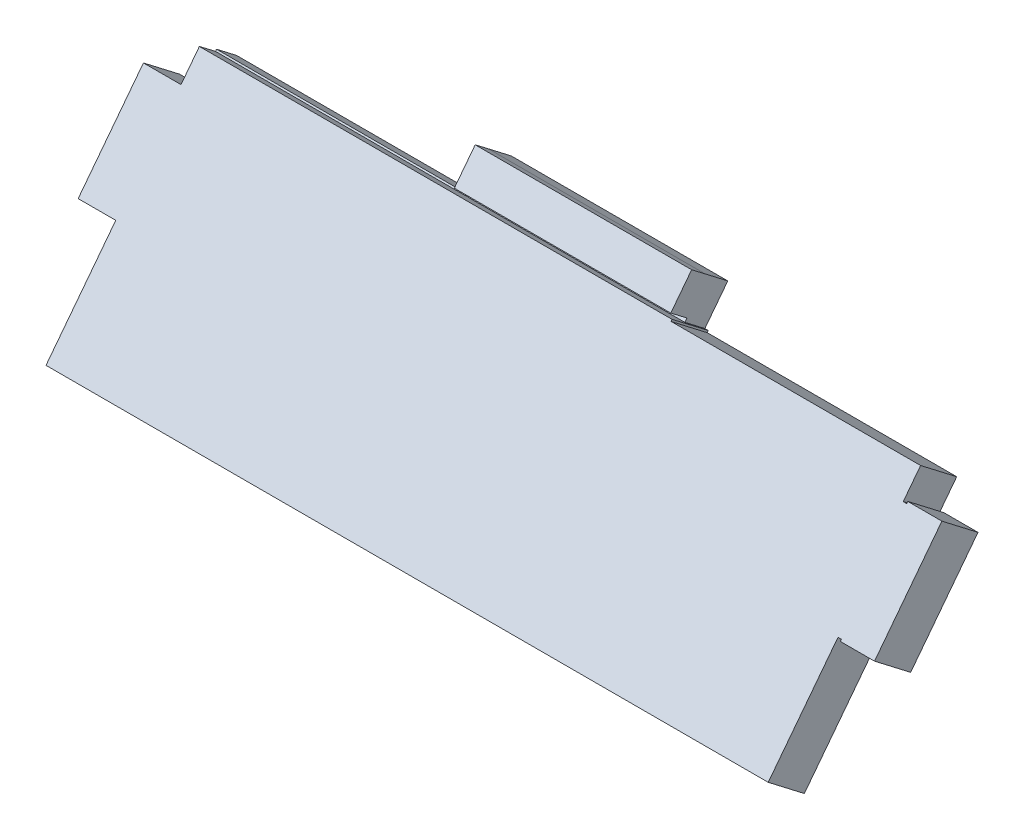
ISO-10303-21;
HEADER;
FILE_DESCRIPTION(('STEP AP214'),'2;1');
FILE_NAME('part.step','',(''),(''),'','','');
FILE_SCHEMA(('AUTOMOTIVE_DESIGN { 1 0 10303 214 1 1 1 1 }'));
ENDSEC;
DATA;
#1=APPLICATION_CONTEXT('core data for automotive mechanical design processes');
#2=APPLICATION_PROTOCOL_DEFINITION('international standard','automotive_design',2000,#1);
#3=PRODUCT_CONTEXT('',#1,'mechanical');
#4=PRODUCT('Part','Part','',(#3));
#5=PRODUCT_RELATED_PRODUCT_CATEGORY('part','',(#4));
#6=PRODUCT_DEFINITION_FORMATION('','',#4);
#7=PRODUCT_DEFINITION_CONTEXT('part definition',#1,'design');
#8=PRODUCT_DEFINITION('design','',#6,#7);
#9=PRODUCT_DEFINITION_SHAPE('','',#8);
#10=(LENGTH_UNIT() NAMED_UNIT(*) SI_UNIT(.MILLI.,.METRE.));
#11=(NAMED_UNIT(*) PLANE_ANGLE_UNIT() SI_UNIT($,.RADIAN.));
#12=(NAMED_UNIT(*) SI_UNIT($,.STERADIAN.) SOLID_ANGLE_UNIT());
#13=UNCERTAINTY_MEASURE_WITH_UNIT(LENGTH_MEASURE(1.E-05),#10,'distance_accuracy_value','');
#14=(GEOMETRIC_REPRESENTATION_CONTEXT(3) GLOBAL_UNCERTAINTY_ASSIGNED_CONTEXT((#13)) GLOBAL_UNIT_ASSIGNED_CONTEXT((#10,
#11,#12)) REPRESENTATION_CONTEXT('',''));
#15=CARTESIAN_POINT('',(0.,0.,0.));
#16=DIRECTION('',(0.,0.,1.));
#17=DIRECTION('',(1.,0.,0.));
#18=AXIS2_PLACEMENT_3D('',#15,#16,#17);
#19=CARTESIAN_POINT('',(285.200000000001,78.6438868512442,-60.463038799988));
#20=DIRECTION('',(-1.,0.,0.));
#21=DIRECTION('',(0.,0.,-1.));
#22=AXIS2_PLACEMENT_3D('',#19,#20,#21);
#23=PLANE('',#22);
#24=DIRECTION('',(0.,-0.609506439516001,-0.792781117452055));
#25=VECTOR('',#24,1.);
#26=CARTESIAN_POINT('',(285.200000000001,81.2600645388355,-62.4744100503904));
#27=LINE('',#26,#25);
#28=CARTESIAN_POINT('',(285.200000000001,201.833533007389,94.3547272159438));
#29=VERTEX_POINT('',#28);
#30=CARTESIAN_POINT('',(285.200000000001,200.296538149277,92.3555678598922));
#31=VERTEX_POINT('',#30);
#32=EDGE_CURVE('E235',#29,#31,#27,.T.);
#33=ORIENTED_EDGE('',*,*,#32,.T.);
#34=DIRECTION('',(0.,0.792781117452051,-0.609506439516005));
#35=VECTOR('',#34,1.);
#36=CARTESIAN_POINT('',(285.200000000001,197.680360461686,94.3669391102944));
#37=LINE('',#36,#35);
#38=CARTESIAN_POINT('',(285.200000000001,197.680360461686,94.3669391102944));
#39=VERTEX_POINT('',#38);
#40=EDGE_CURVE('E293',#39,#31,#37,.T.);
#41=ORIENTED_EDGE('',*,*,#40,.F.);
#42=DIRECTION('',(0.,-0.609506439516003,-0.792781117452053));
#43=VECTOR('',#42,1.);
#44=CARTESIAN_POINT('',(285.200000000001,78.6438868512442,-60.463038799988));
#45=LINE('',#44,#43);
#46=CARTESIAN_POINT('',(285.200000000001,199.034503387945,96.1282641311136));
#47=VERTEX_POINT('',#46);
#48=EDGE_CURVE('E287',#47,#39,#45,.T.);
#49=ORIENTED_EDGE('',*,*,#48,.F.);
#50=DIRECTION('',(0.,0.792781117452081,-0.609506439515965));
#51=VECTOR('',#50,1.);
#52=CARTESIAN_POINT('',(285.200000000001,199.272337723181,95.9454121992587));
#53=LINE('',#52,#51);
#54=CARTESIAN_POINT('',(285.200000000001,199.272337723181,95.9454121992587));
#55=VERTEX_POINT('',#54);
#56=EDGE_CURVE('E429',#47,#55,#53,.T.);
#57=ORIENTED_EDGE('',*,*,#56,.T.);
#58=CARTESIAN_POINT('',(285.199999999975,4.24818282997647,245.883996320196));
#59=DIRECTION('',(1.,0.,0.));
#60=DIRECTION('',(0.,0.,-1.));
#61=AXIS2_PLACEMENT_3D('',#58,#59,#60);
#62=CIRCLE('',#61,246.);
#63=CARTESIAN_POINT('',(285.200000000001,200.351124877341,97.3591293100959));
#64=VERTEX_POINT('',#63);
#65=EDGE_CURVE('E310',#55,#64,#62,.T.);
#66=ORIENTED_EDGE('',*,*,#65,.T.);
#67=DIRECTION('',(0.,0.792781117452051,-0.609506439516005));
#68=VECTOR('',#67,1.);
#69=CARTESIAN_POINT('',(285.200000000001,200.11838621975,97.5380635801026));
#70=LINE('',#69,#68);
#71=CARTESIAN_POINT('',(285.200000000001,202.731075398266,95.5293743672744));
#72=VERTEX_POINT('',#71);
#73=EDGE_CURVE('E238',#64,#72,#70,.T.);
#74=ORIENTED_EDGE('',*,*,#73,.T.);
#75=CARTESIAN_POINT('',(285.200000000001,4.97086643496067,245.706796954713));
#76=DIRECTION('',(1.,0.,0.));
#77=DIRECTION('',(0.,0.,-1.));
#78=AXIS2_PLACEMENT_3D('',#75,#76,#77);
#79=CIRCLE('',#78,248.319065929736);
#80=EDGE_CURVE('E227',#72,#29,#79,.F.);
#81=ORIENTED_EDGE('',*,*,#80,.T.);
#82=EDGE_LOOP('',(#33,#41,#49,#57,#66,#74,#81));
#83=FACE_BOUND('',#82,.T.);
#84=ADVANCED_FACE('F36',(#83),#23,.T.);
#85=CARTESIAN_POINT('',(304.199999999999,78.6438868512442,-60.463038799988));
#86=DIRECTION('',(1.,0.,0.));
#87=DIRECTION('',(0.,0.,1.));
#88=AXIS2_PLACEMENT_3D('',#85,#86,#87);
#89=PLANE('',#88);
#90=DIRECTION('',(0.,0.609506439516001,0.792781117452055));
#91=VECTOR('',#90,1.);
#92=CARTESIAN_POINT('',(304.199999999999,81.2600645388355,-62.4744100503904));
#93=LINE('',#92,#91);
#94=CARTESIAN_POINT('',(304.199999999999,200.296538149277,92.3555678598922));
#95=VERTEX_POINT('',#94);
#96=CARTESIAN_POINT('',(304.199999999999,201.833533007389,94.3547272159435));
#97=VERTEX_POINT('',#96);
#98=EDGE_CURVE('E11',#95,#97,#93,.T.);
#99=ORIENTED_EDGE('',*,*,#98,.T.);
#100=CARTESIAN_POINT('',(304.199999999999,4.97086643496067,245.706796954713));
#101=DIRECTION('',(-1.,0.,0.));
#102=DIRECTION('',(0.,0.,1.));
#103=AXIS2_PLACEMENT_3D('',#100,#101,#102);
#104=CIRCLE('',#103,248.319065929736);
#105=CARTESIAN_POINT('',(304.199999999999,202.731075398266,95.5293743672744));
#106=VERTEX_POINT('',#105);
#107=EDGE_CURVE('E44',#97,#106,#104,.F.);
#108=ORIENTED_EDGE('',*,*,#107,.T.);
#109=DIRECTION('',(0.,0.792781117452051,-0.609506439516005));
#110=VECTOR('',#109,1.);
#111=CARTESIAN_POINT('',(304.199999999999,200.11838621975,97.5380635801026));
#112=LINE('',#111,#110);
#113=CARTESIAN_POINT('',(304.19999999998,200.351124877341,97.3591293100959));
#114=VERTEX_POINT('',#113);
#115=EDGE_CURVE('E296',#114,#106,#112,.T.);
#116=ORIENTED_EDGE('',*,*,#115,.F.);
#117=CARTESIAN_POINT('',(304.19999999998,4.24818282997641,245.883996320196));
#118=DIRECTION('',(-1.,0.,0.));
#119=DIRECTION('',(0.,0.,1.));
#120=AXIS2_PLACEMENT_3D('',#117,#118,#119);
#121=CIRCLE('',#120,246.);
#122=CARTESIAN_POINT('',(304.199999999999,199.272337723181,95.9454121992587));
#123=VERTEX_POINT('',#122);
#124=EDGE_CURVE('E307',#114,#123,#121,.T.);
#125=ORIENTED_EDGE('',*,*,#124,.T.);
#126=DIRECTION('',(0.,-0.792781117452081,0.609506439515965));
#127=VECTOR('',#126,1.);
#128=CARTESIAN_POINT('',(304.199999999999,199.272337723181,95.9454121992587));
#129=LINE('',#128,#127);
#130=CARTESIAN_POINT('',(304.199999999999,199.034503387945,96.1282641311135));
#131=VERTEX_POINT('',#130);
#132=EDGE_CURVE('E341',#123,#131,#129,.T.);
#133=ORIENTED_EDGE('',*,*,#132,.T.);
#134=DIRECTION('',(0.,0.609506439516003,0.792781117452053));
#135=VECTOR('',#134,1.);
#136=CARTESIAN_POINT('',(304.199999999999,78.6438868512442,-60.463038799988));
#137=LINE('',#136,#135);
#138=CARTESIAN_POINT('',(304.199999999999,197.680360461686,94.3669391102944));
#139=VERTEX_POINT('',#138);
#140=EDGE_CURVE('E290',#139,#131,#137,.T.);
#141=ORIENTED_EDGE('',*,*,#140,.F.);
#142=DIRECTION('',(0.,0.792781117452051,-0.609506439516005));
#143=VECTOR('',#142,1.);
#144=CARTESIAN_POINT('',(304.199999999999,197.680360461686,94.3669391102944));
#145=LINE('',#144,#143);
#146=EDGE_CURVE('E299',#139,#95,#145,.T.);
#147=ORIENTED_EDGE('',*,*,#146,.T.);
#148=EDGE_LOOP('',(#99,#108,#116,#125,#133,#141,#147));
#149=FACE_BOUND('',#148,.T.);
#150=ADVANCED_FACE('F441',(#149),#89,.T.);
#151=CARTESIAN_POINT('',(326.4,198.319486701697,99.2995092169303));
#152=DIRECTION('',(0.,0.792781117452052,-0.609506439516003));
#153=DIRECTION('',(0.,0.609506439516003,0.792781117452053));
#154=AXIS2_PLACEMENT_3D('',#151,#152,#153);
#155=PLANE('',#154);
#156=DIRECTION('',(-1.,0.,0.));
#157=VECTOR('',#156,1.);
#158=CARTESIAN_POINT('',(359.949570915867,195.698609011778,95.8905504118865));
#159=LINE('',#158,#157);
#160=CARTESIAN_POINT('',(329.7,195.698609011778,95.8905504118865));
#161=VERTEX_POINT('',#160);
#162=CARTESIAN_POINT('',(326.7,195.698609011778,95.8905504118865));
#163=VERTEX_POINT('',#162);
#164=EDGE_CURVE('E346',#161,#163,#159,.T.);
#165=ORIENTED_EDGE('',*,*,#164,.T.);
#166=DIRECTION('',(0.,0.609506439516003,0.792781117452053));
#167=VECTOR('',#166,1.);
#168=CARTESIAN_POINT('',(326.7,198.319486701697,99.2995092169303));
#169=LINE('',#168,#167);
#170=CARTESIAN_POINT('',(326.7,198.136634769842,99.0616748816947));
#171=VERTEX_POINT('',#170);
#172=EDGE_CURVE('E331',#163,#171,#169,.T.);
#173=ORIENTED_EDGE('',*,*,#172,.T.);
#174=DIRECTION('',(-1.,0.,0.));
#175=VECTOR('',#174,1.);
#176=CARTESIAN_POINT('',(359.949570915867,198.136634769842,99.0616748816947));
#177=LINE('',#176,#175);
#178=CARTESIAN_POINT('',(329.7,198.136634769842,99.0616748816947));
#179=VERTEX_POINT('',#178);
#180=EDGE_CURVE('E323',#179,#171,#177,.T.);
#181=ORIENTED_EDGE('',*,*,#180,.F.);
#182=DIRECTION('',(0.,0.609506439516003,0.792781117452053));
#183=VECTOR('',#182,1.);
#184=CARTESIAN_POINT('',(329.7,198.319486701697,99.2995092169303));
#185=LINE('',#184,#183);
#186=EDGE_CURVE('E245',#161,#179,#185,.T.);
#187=ORIENTED_EDGE('',*,*,#186,.F.);
#188=EDGE_LOOP('',(#165,#173,#181,#187));
#189=FACE_BOUND('',#188,.T.);
#190=ADVANCED_FACE('F486',(#189),#155,.T.);
#191=CARTESIAN_POINT('',(326.4,187.825780240638,101.564928539956));
#192=DIRECTION('',(0.,-0.79278111745205,0.609506439516005));
#193=DIRECTION('',(0.,-0.609506439516005,-0.792781117452051));
#194=AXIS2_PLACEMENT_3D('',#191,#192,#193);
#195=PLANE('',#194);
#196=DIRECTION('',(1.,0.,0.));
#197=VECTOR('',#196,1.);
#198=CARTESIAN_POINT('',(359.949570915867,190.446657930557,104.973887345));
#199=LINE('',#198,#197);
#200=CARTESIAN_POINT('',(326.7,190.446657930557,104.973887345));
#201=VERTEX_POINT('',#200);
#202=CARTESIAN_POINT('',(329.7,190.446657930557,104.973887345));
#203=VERTEX_POINT('',#202);
#204=EDGE_CURVE('E370',#201,#203,#199,.T.);
#205=ORIENTED_EDGE('',*,*,#204,.F.);
#206=DIRECTION('',(0.,-0.609506439516005,-0.792781117452051));
#207=VECTOR('',#206,1.);
#208=CARTESIAN_POINT('',(326.7,187.825780240638,101.564928539956));
#209=LINE('',#208,#207);
#210=CARTESIAN_POINT('',(326.7,188.008632172493,101.802762875192));
#211=VERTEX_POINT('',#210);
#212=EDGE_CURVE('E349',#201,#211,#209,.T.);
#213=ORIENTED_EDGE('',*,*,#212,.T.);
#214=DIRECTION('',(1.,0.,0.));
#215=VECTOR('',#214,1.);
#216=CARTESIAN_POINT('',(359.949570915867,188.008632172493,101.802762875192));
#217=LINE('',#216,#215);
#218=CARTESIAN_POINT('',(329.7,188.008632172493,101.802762875192));
#219=VERTEX_POINT('',#218);
#220=EDGE_CURVE('E353',#211,#219,#217,.T.);
#221=ORIENTED_EDGE('',*,*,#220,.T.);
#222=DIRECTION('',(0.,-0.609506439516005,-0.792781117452051));
#223=VECTOR('',#222,1.);
#224=CARTESIAN_POINT('',(329.7,187.825780240638,101.564928539956));
#225=LINE('',#224,#223);
#226=EDGE_CURVE('E243',#203,#219,#225,.T.);
#227=ORIENTED_EDGE('',*,*,#226,.F.);
#228=EDGE_LOOP('',(#205,#213,#221,#227));
#229=FACE_BOUND('',#228,.T.);
#230=ADVANCED_FACE('F514',(#229),#195,.T.);
#231=CARTESIAN_POINT('',(263.,187.944697408256,101.473502574029));
#232=DIRECTION('',(0.,0.79278111745205,-0.609506439516005));
#233=DIRECTION('',(0.,0.609506439516005,0.792781117452051));
#234=AXIS2_PLACEMENT_3D('',#231,#232,#233);
#235=PLANE('',#234);
#236=DIRECTION('',(0.,-0.609506439516005,-0.792781117452051));
#237=VECTOR('',#236,1.);
#238=CARTESIAN_POINT('',(259.7,187.944697408256,101.473502574029));
#239=LINE('',#238,#237);
#240=CARTESIAN_POINT('',(259.7,190.565575098175,104.882461379073));
#241=VERTEX_POINT('',#240);
#242=CARTESIAN_POINT('',(259.7,188.127549340111,101.711336909264));
#243=VERTEX_POINT('',#242);
#244=EDGE_CURVE('E255',#241,#243,#239,.T.);
#245=ORIENTED_EDGE('',*,*,#244,.T.);
#246=DIRECTION('',(-1.,0.,0.));
#247=VECTOR('',#246,1.);
#248=CARTESIAN_POINT('',(359.949570915867,188.127549340111,101.711336909264));
#249=LINE('',#248,#247);
#250=CARTESIAN_POINT('',(263.,188.127549340111,101.711336909264));
#251=VERTEX_POINT('',#250);
#252=EDGE_CURVE('E407',#251,#243,#249,.T.);
#253=ORIENTED_EDGE('',*,*,#252,.F.);
#254=DIRECTION('',(0.,0.609506439516005,0.792781117452051));
#255=VECTOR('',#254,1.);
#256=CARTESIAN_POINT('',(263.,187.944697408256,101.473502574029));
#257=LINE('',#256,#255);
#258=CARTESIAN_POINT('',(263.,190.565575098175,104.882461379073));
#259=VERTEX_POINT('',#258);
#260=EDGE_CURVE('E379',#251,#259,#257,.T.);
#261=ORIENTED_EDGE('',*,*,#260,.T.);
#262=DIRECTION('',(-1.,0.,0.));
#263=VECTOR('',#262,1.);
#264=CARTESIAN_POINT('',(359.949570915867,190.565575098175,104.882461379073));
#265=LINE('',#264,#263);
#266=EDGE_CURVE('E403',#259,#241,#265,.T.);
#267=ORIENTED_EDGE('',*,*,#266,.T.);
#268=EDGE_LOOP('',(#245,#253,#261,#267));
#269=FACE_BOUND('',#268,.T.);
#270=ADVANCED_FACE('F522',(#269),#235,.F.);
#271=CARTESIAN_POINT('',(263.,198.200569534079,99.3909351828577));
#272=DIRECTION('',(0.,-0.792781117452052,0.609506439516003));
#273=DIRECTION('',(0.,-0.609506439516003,-0.792781117452053));
#274=AXIS2_PLACEMENT_3D('',#271,#272,#273);
#275=PLANE('',#274);
#276=DIRECTION('',(0.,0.609506439516003,0.792781117452053));
#277=VECTOR('',#276,1.);
#278=CARTESIAN_POINT('',(259.7,198.200569534079,99.3909351828577));
#279=LINE('',#278,#277);
#280=CARTESIAN_POINT('',(259.7,195.57969184416,95.9819763778139));
#281=VERTEX_POINT('',#280);
#282=CARTESIAN_POINT('',(259.7,198.017717602224,99.1531008476221));
#283=VERTEX_POINT('',#282);
#284=EDGE_CURVE('E252',#281,#283,#279,.T.);
#285=ORIENTED_EDGE('',*,*,#284,.T.);
#286=DIRECTION('',(1.,0.,0.));
#287=VECTOR('',#286,1.);
#288=CARTESIAN_POINT('',(359.949570915867,198.017717602224,99.1531008476221));
#289=LINE('',#288,#287);
#290=CARTESIAN_POINT('',(263.,198.017717602224,99.1531008476221));
#291=VERTEX_POINT('',#290);
#292=EDGE_CURVE('E400',#283,#291,#289,.T.);
#293=ORIENTED_EDGE('',*,*,#292,.T.);
#294=DIRECTION('',(0.,-0.609506439516003,-0.792781117452053));
#295=VECTOR('',#294,1.);
#296=CARTESIAN_POINT('',(263.,198.200569534079,99.3909351828577));
#297=LINE('',#296,#295);
#298=CARTESIAN_POINT('',(263.,195.57969184416,95.9819763778139));
#299=VERTEX_POINT('',#298);
#300=EDGE_CURVE('E409',#291,#299,#297,.T.);
#301=ORIENTED_EDGE('',*,*,#300,.T.);
#302=DIRECTION('',(1.,0.,0.));
#303=VECTOR('',#302,1.);
#304=CARTESIAN_POINT('',(359.949570915867,195.57969184416,95.9819763778139));
#305=LINE('',#304,#303);
#306=EDGE_CURVE('E404',#281,#299,#305,.T.);
#307=ORIENTED_EDGE('',*,*,#306,.F.);
#308=EDGE_LOOP('',(#285,#293,#301,#307));
#309=FACE_BOUND('',#308,.T.);
#310=ADVANCED_FACE('F534',(#309),#275,.F.);
#311=CARTESIAN_POINT('',(359.949570915867,182.601472375238,111.00542746358));
#312=DIRECTION('',(0.,-0.609506439516006,-0.792781117452051));
#313=DIRECTION('',(0.,0.792781117452051,-0.609506439516005));
#314=AXIS2_PLACEMENT_3D('',#311,#312,#313);
#315=PLANE('',#314);
#316=DIRECTION('',(0.,-0.792781117452051,0.609506439516005));
#317=VECTOR('',#316,1.);
#318=CARTESIAN_POINT('',(259.7,182.601472375238,111.00542746358));
#319=LINE('',#318,#317);
#320=EDGE_CURVE('E258',#283,#241,#319,.T.);
#321=ORIENTED_EDGE('',*,*,#320,.T.);
#322=ORIENTED_EDGE('',*,*,#266,.F.);
#323=DIRECTION('',(0.,0.792781117452051,-0.609506439516005));
#324=VECTOR('',#323,1.);
#325=CARTESIAN_POINT('',(263.,182.601472375238,111.00542746358));
#326=LINE('',#325,#324);
#327=CARTESIAN_POINT('',(263.,182.601472375238,111.00542746358));
#328=VERTEX_POINT('',#327);
#329=EDGE_CURVE('E391',#328,#259,#326,.T.);
#330=ORIENTED_EDGE('',*,*,#329,.F.);
#331=DIRECTION('',(-1.,0.,0.));
#332=VECTOR('',#331,1.);
#333=CARTESIAN_POINT('',(359.949570915867,182.601472375238,111.00542746358));
#334=LINE('',#333,#332);
#335=CARTESIAN_POINT('',(326.4,182.601472375238,111.00542746358));
#336=VERTEX_POINT('',#335);
#337=EDGE_CURVE('E383',#336,#328,#334,.T.);
#338=ORIENTED_EDGE('',*,*,#337,.F.);
#339=DIRECTION('',(0.,-0.792781117452051,0.609506439516005));
#340=VECTOR('',#339,1.);
#341=CARTESIAN_POINT('',(326.4,182.601472375238,111.00542746358));
#342=LINE('',#341,#340);
#343=CARTESIAN_POINT('',(326.4,190.565575098175,104.882461379073));
#344=VERTEX_POINT('',#343);
#345=EDGE_CURVE('E380',#344,#336,#342,.T.);
#346=ORIENTED_EDGE('',*,*,#345,.F.);
#347=DIRECTION('',(-1.,0.,0.));
#348=VECTOR('',#347,1.);
#349=CARTESIAN_POINT('',(326.7,190.565575098175,104.882461379073));
#350=LINE('',#349,#348);
#351=CARTESIAN_POINT('',(326.7,190.565575098175,104.882461379073));
#352=VERTEX_POINT('',#351);
#353=EDGE_CURVE('E334',#352,#344,#350,.T.);
#354=ORIENTED_EDGE('',*,*,#353,.F.);
#355=DIRECTION('',(0.,0.792781117452051,-0.609506439516005));
#356=VECTOR('',#355,1.);
#357=CARTESIAN_POINT('',(326.7,182.601472375238,111.00542746358));
#358=LINE('',#357,#356);
#359=EDGE_CURVE('E338',#201,#352,#358,.T.);
#360=ORIENTED_EDGE('',*,*,#359,.F.);
#361=ORIENTED_EDGE('',*,*,#204,.T.);
#362=DIRECTION('',(0.,0.792781117452051,-0.609506439516005));
#363=VECTOR('',#362,1.);
#364=CARTESIAN_POINT('',(329.7,182.601472375238,111.00542746358));
#365=LINE('',#364,#363);
#366=EDGE_CURVE('E250',#203,#179,#365,.T.);
#367=ORIENTED_EDGE('',*,*,#366,.T.);
#368=ORIENTED_EDGE('',*,*,#180,.T.);
#369=CARTESIAN_POINT('',(326.7,198.017717602224,99.1531008476221));
#370=VERTEX_POINT('',#369);
#371=EDGE_CURVE('E359',#370,#171,#358,.T.);
#372=ORIENTED_EDGE('',*,*,#371,.F.);
#373=DIRECTION('',(-1.,0.,0.));
#374=VECTOR('',#373,1.);
#375=CARTESIAN_POINT('',(326.7,198.017717602224,99.1531008476221));
#376=LINE('',#375,#374);
#377=CARTESIAN_POINT('',(326.4,198.017717602224,99.1531008476221));
#378=VERTEX_POINT('',#377);
#379=EDGE_CURVE('E330',#370,#378,#376,.T.);
#380=ORIENTED_EDGE('',*,*,#379,.T.);
#381=DIRECTION('',(0.,-0.792781117452051,0.609506439516005));
#382=VECTOR('',#381,1.);
#383=CARTESIAN_POINT('',(326.4,182.601472375238,111.00542746358));
#384=LINE('',#383,#382);
#385=CARTESIAN_POINT('',(326.4,199.999469052132,97.6294895460299));
#386=VERTEX_POINT('',#385);
#387=EDGE_CURVE('E371',#386,#378,#384,.T.);
#388=ORIENTED_EDGE('',*,*,#387,.F.);
#389=DIRECTION('',(1.,0.,0.));
#390=VECTOR('',#389,1.);
#391=CARTESIAN_POINT('',(359.949570915867,199.999469052132,97.6294895460299));
#392=LINE('',#391,#390);
#393=CARTESIAN_POINT('',(304.499999999999,199.999469052132,97.6294895460299));
#394=VERTEX_POINT('',#393);
#395=EDGE_CURVE('E284',#394,#386,#392,.T.);
#396=ORIENTED_EDGE('',*,*,#395,.F.);
#397=DIRECTION('',(0.,0.792781117452051,-0.609506439516005));
#398=VECTOR('',#397,1.);
#399=CARTESIAN_POINT('',(304.499999999999,182.601472375238,111.00542746358));
#400=LINE('',#399,#398);
#401=CARTESIAN_POINT('',(304.499999999999,200.113284320114,97.5419860255457));
#402=VERTEX_POINT('',#401);
#403=EDGE_CURVE('E281',#394,#402,#400,.T.);
#404=ORIENTED_EDGE('',*,*,#403,.T.);
#405=DIRECTION('',(-1.,0.,0.));
#406=VECTOR('',#405,1.);
#407=CARTESIAN_POINT('',(330.7,200.113284320114,97.5419860255457));
#408=LINE('',#407,#406);
#409=CARTESIAN_POINT('',(263.,200.113284320114,97.5419860255457));
#410=VERTEX_POINT('',#409);
#411=EDGE_CURVE('E374',#410,#402,#408,.F.);
#412=ORIENTED_EDGE('',*,*,#411,.F.);
#413=DIRECTION('',(0.,0.792781117452051,-0.609506439516005));
#414=VECTOR('',#413,1.);
#415=CARTESIAN_POINT('',(263.,182.601472375238,111.00542746358));
#416=LINE('',#415,#414);
#417=EDGE_CURVE('E386',#291,#410,#416,.T.);
#418=ORIENTED_EDGE('',*,*,#417,.F.);
#419=ORIENTED_EDGE('',*,*,#292,.F.);
#420=EDGE_LOOP('',(#321,#322,#330,#338,#346,#354,#360,#361,#367,#368,#372,#380,#388,#396,#404,
#412,#418,#419));
#421=FACE_BOUND('',#420,.T.);
#422=ADVANCED_FACE('F477',(#421),#315,.F.);
#423=CARTESIAN_POINT('',(359.949570915867,180.163446617174,107.834302993772));
#424=DIRECTION('',(0.,-0.609506439516006,-0.792781117452051));
#425=DIRECTION('',(0.,0.792781117452051,-0.609506439516005));
#426=AXIS2_PLACEMENT_3D('',#423,#424,#425);
#427=PLANE('',#426);
#428=DIRECTION('',(1.,0.,0.));
#429=VECTOR('',#428,1.);
#430=CARTESIAN_POINT('',(359.949570915867,200.296538149277,92.3555678598922));
#431=LINE('',#430,#429);
#432=EDGE_CURVE('E239',#31,#95,#431,.T.);
#433=ORIENTED_EDGE('',*,*,#432,.T.);
#434=ORIENTED_EDGE('',*,*,#146,.F.);
#435=DIRECTION('',(-1.,0.,0.));
#436=VECTOR('',#435,1.);
#437=CARTESIAN_POINT('',(359.949570915867,197.680360461686,94.3669391102944));
#438=LINE('',#437,#436);
#439=CARTESIAN_POINT('',(304.499999999999,197.680360461686,94.3669391102944));
#440=VERTEX_POINT('',#439);
#441=EDGE_CURVE('E315',#440,#139,#438,.T.);
#442=ORIENTED_EDGE('',*,*,#441,.F.);
#443=DIRECTION('',(0.,0.792781117452051,-0.609506439516005));
#444=VECTOR('',#443,1.);
#445=CARTESIAN_POINT('',(304.499999999999,197.561443294068,94.4583650762217));
#446=LINE('',#445,#444);
#447=CARTESIAN_POINT('',(304.499999999999,197.561443294068,94.4583650762217));
#448=VERTEX_POINT('',#447);
#449=EDGE_CURVE('E272',#448,#440,#446,.T.);
#450=ORIENTED_EDGE('',*,*,#449,.F.);
#451=DIRECTION('',(1.,0.,0.));
#452=VECTOR('',#451,1.);
#453=CARTESIAN_POINT('',(304.499999999999,197.561443294068,94.4583650762217));
#454=LINE('',#453,#452);
#455=CARTESIAN_POINT('',(326.4,197.561443294068,94.4583650762217));
#456=VERTEX_POINT('',#455);
#457=EDGE_CURVE('E269',#448,#456,#454,.T.);
#458=ORIENTED_EDGE('',*,*,#457,.T.);
#459=DIRECTION('',(0.,0.792781117452051,-0.609506439516005));
#460=VECTOR('',#459,1.);
#461=CARTESIAN_POINT('',(326.4,180.163446617174,107.834302993772));
#462=LINE('',#461,#460);
#463=CARTESIAN_POINT('',(326.4,195.57969184416,95.9819763778139));
#464=VERTEX_POINT('',#463);
#465=EDGE_CURVE('E345',#464,#456,#462,.T.);
#466=ORIENTED_EDGE('',*,*,#465,.F.);
#467=DIRECTION('',(-1.,0.,0.));
#468=VECTOR('',#467,1.);
#469=CARTESIAN_POINT('',(326.7,195.57969184416,95.9819763778139));
#470=LINE('',#469,#468);
#471=CARTESIAN_POINT('',(326.7,195.57969184416,95.9819763778139));
#472=VERTEX_POINT('',#471);
#473=EDGE_CURVE('E342',#472,#464,#470,.T.);
#474=ORIENTED_EDGE('',*,*,#473,.F.);
#475=DIRECTION('',(0.,0.792781117452051,-0.609506439516005));
#476=VECTOR('',#475,1.);
#477=CARTESIAN_POINT('',(326.7,180.163446617174,107.834302993772));
#478=LINE('',#477,#476);
#479=EDGE_CURVE('E322',#472,#163,#478,.T.);
#480=ORIENTED_EDGE('',*,*,#479,.T.);
#481=ORIENTED_EDGE('',*,*,#164,.F.);
#482=DIRECTION('',(0.,0.792781117452051,-0.609506439516005));
#483=VECTOR('',#482,1.);
#484=CARTESIAN_POINT('',(329.7,180.163446617174,107.834302993772));
#485=LINE('',#484,#483);
#486=EDGE_CURVE('E59',#219,#161,#485,.T.);
#487=ORIENTED_EDGE('',*,*,#486,.F.);
#488=ORIENTED_EDGE('',*,*,#220,.F.);
#489=CARTESIAN_POINT('',(326.7,188.127549340111,101.711336909264));
#490=VERTEX_POINT('',#489);
#491=EDGE_CURVE('E327',#211,#490,#478,.T.);
#492=ORIENTED_EDGE('',*,*,#491,.T.);
#493=DIRECTION('',(-1.,0.,0.));
#494=VECTOR('',#493,1.);
#495=CARTESIAN_POINT('',(326.7,188.127549340111,101.711336909264));
#496=LINE('',#495,#494);
#497=CARTESIAN_POINT('',(326.4,188.127549340111,101.711336909264));
#498=VERTEX_POINT('',#497);
#499=EDGE_CURVE('E333',#490,#498,#496,.T.);
#500=ORIENTED_EDGE('',*,*,#499,.T.);
#501=CARTESIAN_POINT('',(326.4,180.163446617174,107.834302993772));
#502=VERTEX_POINT('',#501);
#503=EDGE_CURVE('E350',#502,#498,#462,.T.);
#504=ORIENTED_EDGE('',*,*,#503,.F.);
#505=DIRECTION('',(-1.,0.,0.));
#506=VECTOR('',#505,1.);
#507=CARTESIAN_POINT('',(359.949570915867,180.163446617174,107.834302993772));
#508=LINE('',#507,#506);
#509=CARTESIAN_POINT('',(263.,180.163446617174,107.834302993772));
#510=VERTEX_POINT('',#509);
#511=EDGE_CURVE('E356',#502,#510,#508,.T.);
#512=ORIENTED_EDGE('',*,*,#511,.T.);
#513=DIRECTION('',(0.,-0.792781117452051,0.609506439516005));
#514=VECTOR('',#513,1.);
#515=CARTESIAN_POINT('',(263.,180.163446617174,107.834302993772));
#516=LINE('',#515,#514);
#517=EDGE_CURVE('E408',#251,#510,#516,.T.);
#518=ORIENTED_EDGE('',*,*,#517,.F.);
#519=ORIENTED_EDGE('',*,*,#252,.T.);
#520=DIRECTION('',(0.,-0.792781117452051,0.609506439516005));
#521=VECTOR('',#520,1.);
#522=CARTESIAN_POINT('',(259.7,180.163446617174,107.834302993772));
#523=LINE('',#522,#521);
#524=EDGE_CURVE('E438',#281,#243,#523,.T.);
#525=ORIENTED_EDGE('',*,*,#524,.F.);
#526=ORIENTED_EDGE('',*,*,#306,.T.);
#527=CARTESIAN_POINT('',(263.,197.799277629303,94.2755131443669));
#528=VERTEX_POINT('',#527);
#529=EDGE_CURVE('E422',#528,#299,#516,.T.);
#530=ORIENTED_EDGE('',*,*,#529,.F.);
#531=DIRECTION('',(-1.,0.,0.));
#532=VECTOR('',#531,1.);
#533=CARTESIAN_POINT('',(284.900000000001,197.799277629303,94.2755131443669));
#534=LINE('',#533,#532);
#535=CARTESIAN_POINT('',(284.900000000001,197.799277629303,94.2755131443669));
#536=VERTEX_POINT('',#535);
#537=EDGE_CURVE('E260',#536,#528,#534,.T.);
#538=ORIENTED_EDGE('',*,*,#537,.F.);
#539=DIRECTION('',(0.,-0.792781117452051,0.609506439516005));
#540=VECTOR('',#539,1.);
#541=CARTESIAN_POINT('',(284.900000000001,180.163446617174,107.834302993772));
#542=LINE('',#541,#540);
#543=CARTESIAN_POINT('',(284.900000000001,197.680360461686,94.3669391102944));
#544=VERTEX_POINT('',#543);
#545=EDGE_CURVE('E316',#536,#544,#542,.T.);
#546=ORIENTED_EDGE('',*,*,#545,.T.);
#547=EDGE_CURVE('E312',#39,#544,#438,.T.);
#548=ORIENTED_EDGE('',*,*,#547,.F.);
#549=ORIENTED_EDGE('',*,*,#40,.T.);
#550=EDGE_LOOP('',(#433,#434,#442,#450,#458,#466,#474,#480,#481,#487,#488,#492,#500,#504,#512,
#518,#519,#525,#526,#530,#538,#546,#548,#549));
#551=FACE_BOUND('',#550,.T.);
#552=ADVANCED_FACE('F446',(#551),#427,.T.);
#553=CARTESIAN_POINT('',(0.,200.11838621975,97.5380635801026));
#554=DIRECTION('',(0.,0.609506439516005,0.792781117452051));
#555=DIRECTION('',(0.,-0.792781117452051,0.609506439516005));
#556=AXIS2_PLACEMENT_3D('',#553,#554,#555);
#557=PLANE('',#556);
#558=DIRECTION('',(-1.,0.,0.));
#559=VECTOR('',#558,1.);
#560=CARTESIAN_POINT('',(330.701333630157,202.731075398266,95.5293743672744));
#561=LINE('',#560,#559);
#562=EDGE_CURVE('E230',#106,#72,#561,.T.);
#563=ORIENTED_EDGE('',*,*,#562,.T.);
#564=ORIENTED_EDGE('',*,*,#73,.F.);
#565=DIRECTION('',(1.,0.,0.));
#566=VECTOR('',#565,1.);
#567=CARTESIAN_POINT('',(-500000.,200.351124877341,97.3591293100957));
#568=LINE('',#567,#566);
#569=EDGE_CURVE('E435',#64,#114,#568,.T.);
#570=ORIENTED_EDGE('',*,*,#569,.T.);
#571=ORIENTED_EDGE('',*,*,#115,.T.);
#572=EDGE_LOOP('',(#563,#564,#570,#571));
#573=FACE_BOUND('',#572,.T.);
#574=ADVANCED_FACE('F468',(#573),#557,.T.);
#575=CARTESIAN_POINT('',(-500000.,4.24818282997649,245.883996320196));
#576=DIRECTION('',(1.,0.,0.));
#577=DIRECTION('',(0.,0.,1.));
#578=AXIS2_PLACEMENT_3D('',#575,#576,#577);
#579=CYLINDRICAL_SURFACE('',#578,246.);
#580=DIRECTION('',(-1.,0.,0.));
#581=VECTOR('',#580,1.);
#582=CARTESIAN_POINT('',(330.7,199.272337723181,95.9454121992587));
#583=LINE('',#582,#581);
#584=EDGE_CURVE('E319',#123,#55,#583,.T.);
#585=ORIENTED_EDGE('',*,*,#584,.F.);
#586=ORIENTED_EDGE('',*,*,#124,.F.);
#587=ORIENTED_EDGE('',*,*,#569,.F.);
#588=ORIENTED_EDGE('',*,*,#65,.F.);
#589=EDGE_LOOP('',(#585,#586,#587,#588));
#590=FACE_BOUND('',#589,.T.);
#591=ADVANCED_FACE('F466',(#590),#579,.F.);
#592=CARTESIAN_POINT('',(330.7,199.272337723181,95.9454121992587));
#593=DIRECTION('',(0.,0.609506439515966,0.792781117452081));
#594=DIRECTION('',(0.,-0.792781117452081,0.609506439515965));
#595=AXIS2_PLACEMENT_3D('',#592,#593,#594);
#596=PLANE('',#595);
#597=DIRECTION('',(-1.,0.,0.));
#598=VECTOR('',#597,1.);
#599=CARTESIAN_POINT('',(330.7,199.034503387945,96.1282641311135));
#600=LINE('',#599,#598);
#601=EDGE_CURVE('E457',#131,#47,#600,.T.);
#602=ORIENTED_EDGE('',*,*,#601,.F.);
#603=ORIENTED_EDGE('',*,*,#132,.F.);
#604=ORIENTED_EDGE('',*,*,#584,.T.);
#605=ORIENTED_EDGE('',*,*,#56,.F.);
#606=EDGE_LOOP('',(#602,#603,#604,#605));
#607=FACE_BOUND('',#606,.T.);
#608=ADVANCED_FACE('F462',(#607),#596,.T.);
#609=CARTESIAN_POINT('',(0.,78.6438868512442,-60.4630387999879));
#610=DIRECTION('',(0.,0.792781117452053,-0.609506439516002));
#611=DIRECTION('',(0.,0.609506439516003,0.792781117452053));
#612=AXIS2_PLACEMENT_3D('',#609,#610,#611);
#613=PLANE('',#612);
#614=DIRECTION('',(0.,0.609506439516003,0.792781117452053));
#615=VECTOR('',#614,1.);
#616=CARTESIAN_POINT('',(304.499999999999,78.6438868512442,-60.4630387999879));
#617=LINE('',#616,#615);
#618=CARTESIAN_POINT('',(304.499999999999,199.034503387945,96.1282641311136));
#619=VERTEX_POINT('',#618);
#620=EDGE_CURVE('E304',#440,#619,#617,.T.);
#621=ORIENTED_EDGE('',*,*,#620,.F.);
#622=ORIENTED_EDGE('',*,*,#441,.T.);
#623=ORIENTED_EDGE('',*,*,#140,.T.);
#624=EDGE_CURVE('E397',#619,#131,#600,.T.);
#625=ORIENTED_EDGE('',*,*,#624,.F.);
#626=EDGE_LOOP('',(#621,#622,#623,#625));
#627=FACE_BOUND('',#626,.T.);
#628=ADVANCED_FACE('F491',(#627),#613,.T.);
#629=CARTESIAN_POINT('',(304.499999999999,200.182320983987,97.8673238812655));
#630=DIRECTION('',(1.,0.,0.));
#631=DIRECTION('',(0.,0.,1.));
#632=AXIS2_PLACEMENT_3D('',#629,#630,#631);
#633=PLANE('',#632);
#634=ORIENTED_EDGE('',*,*,#403,.F.);
#635=DIRECTION('',(0.,-0.609506439516005,-0.792781117452051));
#636=VECTOR('',#635,1.);
#637=CARTESIAN_POINT('',(304.499999999999,200.182320983987,97.8673238812655));
#638=LINE('',#637,#636);
#639=EDGE_CURVE('E276',#394,#448,#638,.T.);
#640=ORIENTED_EDGE('',*,*,#639,.T.);
#641=ORIENTED_EDGE('',*,*,#449,.T.);
#642=ORIENTED_EDGE('',*,*,#620,.T.);
#643=CARTESIAN_POINT('',(304.499999999999,4.24818282997647,245.883996320196));
#644=DIRECTION('',(-1.,0.,0.));
#645=DIRECTION('',(0.,0.,1.));
#646=AXIS2_PLACEMENT_3D('',#643,#644,#645);
#647=CIRCLE('',#646,245.7);
#648=EDGE_CURVE('E278',#402,#619,#647,.T.);
#649=ORIENTED_EDGE('',*,*,#648,.F.);
#650=EDGE_LOOP('',(#634,#640,#641,#642,#649));
#651=FACE_BOUND('',#650,.T.);
#652=ADVANCED_FACE('F589',(#651),#633,.T.);
#653=CARTESIAN_POINT('',(304.499999999999,200.182320983987,97.8673238812655));
#654=DIRECTION('',(0.,-0.792781117452051,0.609506439516005));
#655=DIRECTION('',(0.,-0.609506439516005,-0.792781117452051));
#656=AXIS2_PLACEMENT_3D('',#653,#654,#655);
#657=PLANE('',#656);
#658=ORIENTED_EDGE('',*,*,#639,.F.);
#659=ORIENTED_EDGE('',*,*,#395,.T.);
#660=DIRECTION('',(0.,-0.609506439516005,-0.792781117452051));
#661=VECTOR('',#660,1.);
#662=CARTESIAN_POINT('',(326.4,200.182320983987,97.8673238812655));
#663=LINE('',#662,#661);
#664=EDGE_CURVE('E275',#386,#456,#663,.T.);
#665=ORIENTED_EDGE('',*,*,#664,.T.);
#666=ORIENTED_EDGE('',*,*,#457,.F.);
#667=EDGE_LOOP('',(#658,#659,#665,#666));
#668=FACE_BOUND('',#667,.T.);
#669=ADVANCED_FACE('F525',(#668),#657,.F.);
#670=CARTESIAN_POINT('',(326.4,0.,0.));
#671=DIRECTION('',(-1.,0.,0.));
#672=DIRECTION('',(0.,0.,-1.));
#673=AXIS2_PLACEMENT_3D('',#670,#671,#672);
#674=PLANE('',#673);
#675=ORIENTED_EDGE('',*,*,#387,.T.);
#676=DIRECTION('',(0.,-0.609506439516004,-0.792781117452052));
#677=VECTOR('',#676,1.);
#678=CARTESIAN_POINT('',(326.4,198.017717602224,99.1531008476221));
#679=LINE('',#678,#677);
#680=EDGE_CURVE('E328',#378,#464,#679,.T.);
#681=ORIENTED_EDGE('',*,*,#680,.T.);
#682=ORIENTED_EDGE('',*,*,#465,.T.);
#683=ORIENTED_EDGE('',*,*,#664,.F.);
#684=EDGE_LOOP('',(#675,#681,#682,#683));
#685=FACE_BOUND('',#684,.T.);
#686=ADVANCED_FACE('F510',(#685),#674,.F.);
#687=CARTESIAN_POINT('',(326.7,198.017717602224,99.1531008476221));
#688=DIRECTION('',(0.,-0.792781117452052,0.609506439516003));
#689=DIRECTION('',(0.,-0.609506439516004,-0.792781117452052));
#690=AXIS2_PLACEMENT_3D('',#687,#688,#689);
#691=PLANE('',#690);
#692=ORIENTED_EDGE('',*,*,#680,.F.);
#693=ORIENTED_EDGE('',*,*,#379,.F.);
#694=DIRECTION('',(0.,-0.609506439516004,-0.792781117452052));
#695=VECTOR('',#694,1.);
#696=CARTESIAN_POINT('',(326.7,198.017717602224,99.1531008476221));
#697=LINE('',#696,#695);
#698=EDGE_CURVE('E320',#370,#472,#697,.T.);
#699=ORIENTED_EDGE('',*,*,#698,.T.);
#700=ORIENTED_EDGE('',*,*,#473,.T.);
#701=EDGE_LOOP('',(#692,#693,#699,#700));
#702=FACE_BOUND('',#701,.T.);
#703=ADVANCED_FACE('F501',(#702),#691,.F.);
#704=CARTESIAN_POINT('',(326.7,191.340533523751,169.454269424816));
#705=DIRECTION('',(1.,0.,0.));
#706=DIRECTION('',(0.,0.,1.));
#707=AXIS2_PLACEMENT_3D('',#704,#705,#706);
#708=PLANE('',#707);
#709=ORIENTED_EDGE('',*,*,#698,.F.);
#710=ORIENTED_EDGE('',*,*,#371,.T.);
#711=ORIENTED_EDGE('',*,*,#172,.F.);
#712=ORIENTED_EDGE('',*,*,#479,.F.);
#713=EDGE_LOOP('',(#709,#710,#711,#712));
#714=FACE_BOUND('',#713,.T.);
#715=ADVANCED_FACE('F497',(#714),#708,.F.);
#716=ORIENTED_EDGE('',*,*,#212,.F.);
#717=ORIENTED_EDGE('',*,*,#359,.T.);
#718=DIRECTION('',(0.,0.609506439516005,0.792781117452051));
#719=VECTOR('',#718,1.);
#720=CARTESIAN_POINT('',(326.7,188.127549340111,101.711336909264));
#721=LINE('',#720,#719);
#722=EDGE_CURVE('E324',#490,#352,#721,.T.);
#723=ORIENTED_EDGE('',*,*,#722,.F.);
#724=ORIENTED_EDGE('',*,*,#491,.F.);
#725=EDGE_LOOP('',(#716,#717,#723,#724));
#726=FACE_BOUND('',#725,.T.);
#727=ADVANCED_FACE('F500',(#726),#708,.F.);
#728=CARTESIAN_POINT('',(326.7,188.127549340111,101.711336909264));
#729=DIRECTION('',(0.,0.79278111745205,-0.609506439516005));
#730=DIRECTION('',(0.,0.609506439516005,0.792781117452051));
#731=AXIS2_PLACEMENT_3D('',#728,#729,#730);
#732=PLANE('',#731);
#733=DIRECTION('',(0.,0.609506439516005,0.792781117452051));
#734=VECTOR('',#733,1.);
#735=CARTESIAN_POINT('',(326.4,188.127549340111,101.711336909264));
#736=LINE('',#735,#734);
#737=EDGE_CURVE('E326',#498,#344,#736,.T.);
#738=ORIENTED_EDGE('',*,*,#737,.F.);
#739=ORIENTED_EDGE('',*,*,#499,.F.);
#740=ORIENTED_EDGE('',*,*,#722,.T.);
#741=ORIENTED_EDGE('',*,*,#353,.T.);
#742=EDGE_LOOP('',(#738,#739,#740,#741));
#743=FACE_BOUND('',#742,.T.);
#744=ADVANCED_FACE('F503',(#743),#732,.F.);
#745=CARTESIAN_POINT('',(326.4,0.,0.));
#746=DIRECTION('',(-1.,0.,0.));
#747=DIRECTION('',(0.,0.,-1.));
#748=AXIS2_PLACEMENT_3D('',#745,#746,#747);
#749=PLANE('',#748);
#750=ORIENTED_EDGE('',*,*,#345,.T.);
#751=DIRECTION('',(0.,-0.609506439516004,-0.792781117452052));
#752=VECTOR('',#751,1.);
#753=CARTESIAN_POINT('',(326.4,182.601472375238,111.00542746358));
#754=LINE('',#753,#752);
#755=EDGE_CURVE('E337',#336,#502,#754,.T.);
#756=ORIENTED_EDGE('',*,*,#755,.T.);
#757=ORIENTED_EDGE('',*,*,#503,.T.);
#758=ORIENTED_EDGE('',*,*,#737,.T.);
#759=EDGE_LOOP('',(#750,#756,#757,#758));
#760=FACE_BOUND('',#759,.T.);
#761=ADVANCED_FACE('F506',(#760),#749,.F.);
#762=CARTESIAN_POINT('',(359.949570915867,182.601472375238,111.00542746358));
#763=DIRECTION('',(0.,-0.792781117452052,0.609506439516004));
#764=DIRECTION('',(0.,-0.609506439516004,-0.792781117452052));
#765=AXIS2_PLACEMENT_3D('',#762,#763,#764);
#766=PLANE('',#765);
#767=ORIENTED_EDGE('',*,*,#337,.T.);
#768=DIRECTION('',(0.,0.609506439516004,0.792781117452052));
#769=VECTOR('',#768,1.);
#770=CARTESIAN_POINT('',(263.,182.601472375238,111.00542746358));
#771=LINE('',#770,#769);
#772=EDGE_CURVE('E354',#510,#328,#771,.T.);
#773=ORIENTED_EDGE('',*,*,#772,.F.);
#774=ORIENTED_EDGE('',*,*,#511,.F.);
#775=ORIENTED_EDGE('',*,*,#755,.F.);
#776=EDGE_LOOP('',(#767,#773,#774,#775));
#777=FACE_BOUND('',#776,.T.);
#778=ADVANCED_FACE('F518',(#777),#766,.T.);
#779=CARTESIAN_POINT('',(263.,0.,0.));
#780=DIRECTION('',(1.,0.,0.));
#781=DIRECTION('',(0.,0.,1.));
#782=AXIS2_PLACEMENT_3D('',#779,#780,#781);
#783=PLANE('',#782);
#784=ORIENTED_EDGE('',*,*,#329,.T.);
#785=ORIENTED_EDGE('',*,*,#260,.F.);
#786=ORIENTED_EDGE('',*,*,#517,.T.);
#787=ORIENTED_EDGE('',*,*,#772,.T.);
#788=EDGE_LOOP('',(#784,#785,#786,#787));
#789=FACE_BOUND('',#788,.T.);
#790=ADVANCED_FACE('F530',(#789),#783,.F.);
#791=CARTESIAN_POINT('',(330.7,4.24818282997644,245.883996320196));
#792=DIRECTION('',(-1.,0.,0.));
#793=DIRECTION('',(0.,0.,-1.));
#794=AXIS2_PLACEMENT_3D('',#791,#792,#793);
#795=CYLINDRICAL_SURFACE('',#794,245.7);
#796=ORIENTED_EDGE('',*,*,#648,.T.);
#797=ORIENTED_EDGE('',*,*,#624,.T.);
#798=ORIENTED_EDGE('',*,*,#601,.T.);
#799=CARTESIAN_POINT('',(284.900000000001,199.034503387945,96.1282641311136));
#800=VERTEX_POINT('',#799);
#801=EDGE_CURVE('E426',#47,#800,#600,.T.);
#802=ORIENTED_EDGE('',*,*,#801,.T.);
#803=CARTESIAN_POINT('',(263.,199.034503387945,96.1282641311135));
#804=VERTEX_POINT('',#803);
#805=EDGE_CURVE('E417',#800,#804,#600,.T.);
#806=ORIENTED_EDGE('',*,*,#805,.T.);
#807=CARTESIAN_POINT('',(263.,4.24818282997644,245.883996320196));
#808=DIRECTION('',(1.,0.,0.));
#809=DIRECTION('',(0.,0.,-1.));
#810=AXIS2_PLACEMENT_3D('',#807,#808,#809);
#811=CIRCLE('',#810,245.7);
#812=EDGE_CURVE('E396',#804,#410,#811,.T.);
#813=ORIENTED_EDGE('',*,*,#812,.T.);
#814=ORIENTED_EDGE('',*,*,#411,.T.);
#815=EDGE_LOOP('',(#796,#797,#798,#802,#806,#813,#814));
#816=FACE_BOUND('',#815,.T.);
#817=ADVANCED_FACE('F38',(#816),#795,.T.);
#818=ORIENTED_EDGE('',*,*,#48,.T.);
#819=ORIENTED_EDGE('',*,*,#547,.T.);
#820=DIRECTION('',(0.,-0.609506439516003,-0.792781117452053));
#821=VECTOR('',#820,1.);
#822=CARTESIAN_POINT('',(284.900000000001,78.6438868512442,-60.4630387999879));
#823=LINE('',#822,#821);
#824=EDGE_CURVE('E295',#800,#544,#823,.T.);
#825=ORIENTED_EDGE('',*,*,#824,.F.);
#826=ORIENTED_EDGE('',*,*,#801,.F.);
#827=EDGE_LOOP('',(#818,#819,#825,#826));
#828=FACE_BOUND('',#827,.T.);
#829=ADVANCED_FACE('F451',(#828),#613,.T.);
#830=CARTESIAN_POINT('',(263.,0.,0.));
#831=DIRECTION('',(1.,0.,0.));
#832=DIRECTION('',(0.,0.,1.));
#833=AXIS2_PLACEMENT_3D('',#830,#831,#832);
#834=PLANE('',#833);
#835=DIRECTION('',(0.,-0.609506439516005,-0.792781117452051));
#836=VECTOR('',#835,1.);
#837=CARTESIAN_POINT('',(263.,200.420155319222,97.6844719494107));
#838=LINE('',#837,#836);
#839=CARTESIAN_POINT('',(263.,199.153420555563,96.0368381651862));
#840=VERTEX_POINT('',#839);
#841=EDGE_CURVE('E263',#840,#528,#838,.T.);
#842=ORIENTED_EDGE('',*,*,#841,.T.);
#843=ORIENTED_EDGE('',*,*,#529,.T.);
#844=ORIENTED_EDGE('',*,*,#300,.F.);
#845=ORIENTED_EDGE('',*,*,#417,.T.);
#846=ORIENTED_EDGE('',*,*,#812,.F.);
#847=DIRECTION('',(0.,0.792781117452064,-0.609506439515987));
#848=VECTOR('',#847,1.);
#849=CARTESIAN_POINT('',(263.,199.034503387945,96.1282641311135));
#850=LINE('',#849,#848);
#851=EDGE_CURVE('E393',#804,#840,#850,.T.);
#852=ORIENTED_EDGE('',*,*,#851,.T.);
#853=EDGE_LOOP('',(#842,#843,#844,#845,#846,#852));
#854=FACE_BOUND('',#853,.T.);
#855=ADVANCED_FACE('F490',(#854),#834,.F.);
#856=CARTESIAN_POINT('',(284.900000000001,78.6438868512442,-60.4630387999879));
#857=DIRECTION('',(-1.,0.,0.));
#858=DIRECTION('',(0.,0.,-1.));
#859=AXIS2_PLACEMENT_3D('',#856,#857,#858);
#860=PLANE('',#859);
#861=DIRECTION('',(0.,-0.609506439516005,-0.792781117452051));
#862=VECTOR('',#861,1.);
#863=CARTESIAN_POINT('',(284.900000000001,200.420155319222,97.6844719494107));
#864=LINE('',#863,#862);
#865=CARTESIAN_POINT('',(284.900000000001,199.153420555563,96.0368381651861));
#866=VERTEX_POINT('',#865);
#867=EDGE_CURVE('E264',#866,#536,#864,.T.);
#868=ORIENTED_EDGE('',*,*,#867,.F.);
#869=DIRECTION('',(0.,0.792781117452081,-0.609506439515965));
#870=VECTOR('',#869,1.);
#871=CARTESIAN_POINT('',(284.900000000001,199.272337723181,95.9454121992587));
#872=LINE('',#871,#870);
#873=EDGE_CURVE('E432',#800,#866,#872,.T.);
#874=ORIENTED_EDGE('',*,*,#873,.F.);
#875=ORIENTED_EDGE('',*,*,#824,.T.);
#876=ORIENTED_EDGE('',*,*,#545,.F.);
#877=EDGE_LOOP('',(#868,#874,#875,#876));
#878=FACE_BOUND('',#877,.T.);
#879=ADVANCED_FACE('F492',(#878),#860,.F.);
#880=ORIENTED_EDGE('',*,*,#851,.F.);
#881=ORIENTED_EDGE('',*,*,#805,.F.);
#882=ORIENTED_EDGE('',*,*,#873,.T.);
#883=DIRECTION('',(1.,0.,0.));
#884=VECTOR('',#883,1.);
#885=CARTESIAN_POINT('',(330.7,199.153420555563,96.0368381651861));
#886=LINE('',#885,#884);
#887=EDGE_CURVE('E266',#840,#866,#886,.T.);
#888=ORIENTED_EDGE('',*,*,#887,.F.);
#889=EDGE_LOOP('',(#880,#881,#882,#888));
#890=FACE_BOUND('',#889,.T.);
#891=ADVANCED_FACE('F495',(#890),#596,.T.);
#892=CARTESIAN_POINT('',(284.900000000001,200.420155319222,97.6844719494107));
#893=DIRECTION('',(0.,0.792781117452051,-0.609506439516005));
#894=DIRECTION('',(0.,0.609506439516005,0.792781117452051));
#895=AXIS2_PLACEMENT_3D('',#892,#893,#894);
#896=PLANE('',#895);
#897=ORIENTED_EDGE('',*,*,#841,.F.);
#898=ORIENTED_EDGE('',*,*,#887,.T.);
#899=ORIENTED_EDGE('',*,*,#867,.T.);
#900=ORIENTED_EDGE('',*,*,#537,.T.);
#901=EDGE_LOOP('',(#897,#898,#899,#900));
#902=FACE_BOUND('',#901,.T.);
#903=ADVANCED_FACE('F538',(#902),#896,.T.);
#904=CARTESIAN_POINT('',(329.7,-103.5,-190.868386440488));
#905=DIRECTION('',(1.,0.,0.));
#906=DIRECTION('',(0.,0.,1.));
#907=AXIS2_PLACEMENT_3D('',#904,#905,#906);
#908=PLANE('',#907);
#909=ORIENTED_EDGE('',*,*,#366,.F.);
#910=ORIENTED_EDGE('',*,*,#226,.T.);
#911=ORIENTED_EDGE('',*,*,#486,.T.);
#912=ORIENTED_EDGE('',*,*,#186,.T.);
#913=EDGE_LOOP('',(#909,#910,#911,#912));
#914=FACE_BOUND('',#913,.T.);
#915=ADVANCED_FACE('F572',(#914),#908,.T.);
#916=CARTESIAN_POINT('',(259.7,-103.5,575.412895232632));
#917=DIRECTION('',(-1.,0.,0.));
#918=DIRECTION('',(0.,0.,-1.));
#919=AXIS2_PLACEMENT_3D('',#916,#917,#918);
#920=PLANE('',#919);
#921=ORIENTED_EDGE('',*,*,#320,.F.);
#922=ORIENTED_EDGE('',*,*,#284,.F.);
#923=ORIENTED_EDGE('',*,*,#524,.T.);
#924=ORIENTED_EDGE('',*,*,#244,.F.);
#925=EDGE_LOOP('',(#921,#922,#923,#924));
#926=FACE_BOUND('',#925,.T.);
#927=ADVANCED_FACE('F595',(#926),#920,.T.);
#928=CARTESIAN_POINT('',(330.701333630157,201.833533007389,94.3547272159438));
#929=DIRECTION('',(0.,-0.792781117452054,0.609506439516001));
#930=DIRECTION('',(0.,-0.609506439516001,-0.792781117452055));
#931=AXIS2_PLACEMENT_3D('',#928,#929,#930);
#932=PLANE('',#931);
#933=ORIENTED_EDGE('',*,*,#32,.F.);
#934=DIRECTION('',(-1.,0.,0.));
#935=VECTOR('',#934,1.);
#936=CARTESIAN_POINT('',(330.701333630157,201.833533007389,94.3547272159438));
#937=LINE('',#936,#935);
#938=EDGE_CURVE('E51',#97,#29,#937,.T.);
#939=ORIENTED_EDGE('',*,*,#938,.F.);
#940=ORIENTED_EDGE('',*,*,#98,.F.);
#941=ORIENTED_EDGE('',*,*,#432,.F.);
#942=EDGE_LOOP('',(#933,#939,#940,#941));
#943=FACE_BOUND('',#942,.T.);
#944=ADVANCED_FACE('F241',(#943),#932,.F.);
#945=CARTESIAN_POINT('',(330.701333630157,4.97086643496067,245.706796954713));
#946=DIRECTION('',(-1.,0.,0.));
#947=DIRECTION('',(0.,0.,-1.));
#948=AXIS2_PLACEMENT_3D('',#945,#946,#947);
#949=CYLINDRICAL_SURFACE('',#948,248.319065929736);
#950=ORIENTED_EDGE('',*,*,#80,.F.);
#951=ORIENTED_EDGE('',*,*,#562,.F.);
#952=ORIENTED_EDGE('',*,*,#107,.F.);
#953=ORIENTED_EDGE('',*,*,#938,.T.);
#954=EDGE_LOOP('',(#950,#951,#952,#953));
#955=FACE_BOUND('',#954,.T.);
#956=ADVANCED_FACE('F226',(#955),#949,.T.);
#957=CLOSED_SHELL('',(#84,#150,#190,#230,#270,#310,#422,#552,#574,#591,#608,#628,#652,#669,#686,
#703,#715,#727,#744,#761,#778,#790,#817,#829,#855,#879,#891,#903,#915,#927,#944,#956));
#958=MANIFOLD_SOLID_BREP('B2',#957);
#959=ADVANCED_BREP_SHAPE_REPRESENTATION('',(#18,#958),#14);
#960=SHAPE_DEFINITION_REPRESENTATION(#9,#959);
ENDSEC;
END-ISO-10303-21;
